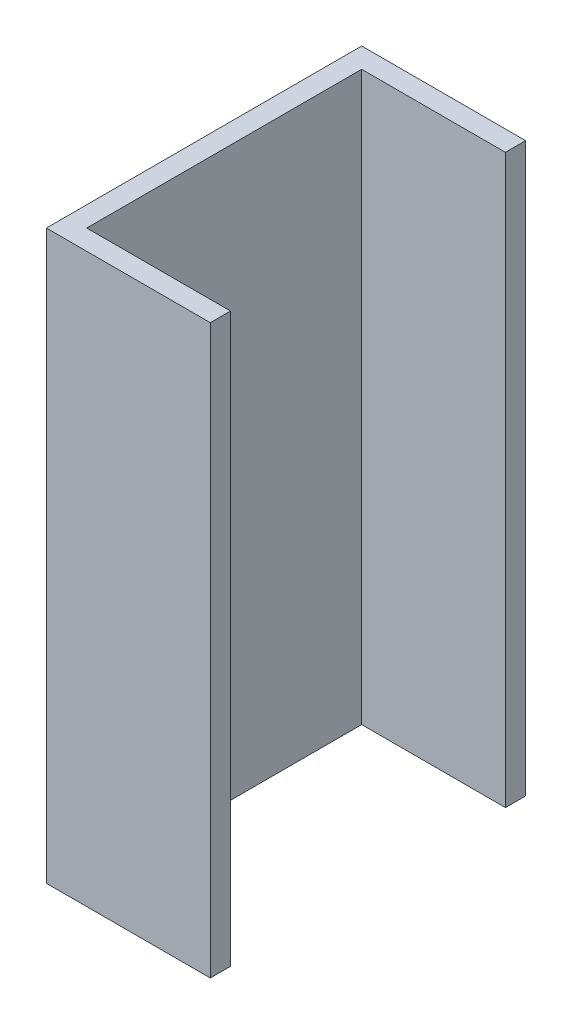
ISO-10303-21;
HEADER;
FILE_DESCRIPTION(('STEP AP214'),'2;1');
FILE_NAME('part.step','',(''),(''),'','','');
FILE_SCHEMA(('AUTOMOTIVE_DESIGN { 1 0 10303 214 1 1 1 1 }'));
ENDSEC;
DATA;
#1=APPLICATION_CONTEXT('core data for automotive mechanical design processes');
#2=APPLICATION_PROTOCOL_DEFINITION('international standard','automotive_design',2000,#1);
#3=PRODUCT_CONTEXT('',#1,'mechanical');
#4=PRODUCT('Part','Part','',(#3));
#5=PRODUCT_RELATED_PRODUCT_CATEGORY('part','',(#4));
#6=PRODUCT_DEFINITION_FORMATION('','',#4);
#7=PRODUCT_DEFINITION_CONTEXT('part definition',#1,'design');
#8=PRODUCT_DEFINITION('design','',#6,#7);
#9=PRODUCT_DEFINITION_SHAPE('','',#8);
#10=(LENGTH_UNIT() NAMED_UNIT(*) SI_UNIT(.MILLI.,.METRE.));
#11=(NAMED_UNIT(*) PLANE_ANGLE_UNIT() SI_UNIT($,.RADIAN.));
#12=(NAMED_UNIT(*) SI_UNIT($,.STERADIAN.) SOLID_ANGLE_UNIT());
#13=UNCERTAINTY_MEASURE_WITH_UNIT(LENGTH_MEASURE(1.E-05),#10,'distance_accuracy_value','');
#14=(GEOMETRIC_REPRESENTATION_CONTEXT(3) GLOBAL_UNCERTAINTY_ASSIGNED_CONTEXT((#13)) GLOBAL_UNIT_ASSIGNED_CONTEXT((#10,
#11,#12)) REPRESENTATION_CONTEXT('',''));
#15=CARTESIAN_POINT('',(0.,0.,0.));
#16=DIRECTION('',(0.,0.,1.));
#17=DIRECTION('',(1.,0.,0.));
#18=AXIS2_PLACEMENT_3D('',#15,#16,#17);
#19=CARTESIAN_POINT('',(65.,112.5,-62.5));
#20=DIRECTION('',(-1.,0.,0.));
#21=DIRECTION('',(0.,0.,1.));
#22=AXIS2_PLACEMENT_3D('',#19,#20,#21);
#23=PLANE('',#22);
#24=DIRECTION('',(0.,0.,-1.));
#25=VECTOR('',#24,1.);
#26=CARTESIAN_POINT('',(65.,-112.5,-62.5));
#27=LINE('',#26,#25);
#28=CARTESIAN_POINT('',(65.,-112.5,-54.5));
#29=VERTEX_POINT('',#28);
#30=CARTESIAN_POINT('',(65.,-112.5,-62.5));
#31=VERTEX_POINT('',#30);
#32=EDGE_CURVE('E133',#29,#31,#27,.T.);
#33=ORIENTED_EDGE('',*,*,#32,.T.);
#34=DIRECTION('',(0.,-1.,0.));
#35=VECTOR('',#34,1.);
#36=CARTESIAN_POINT('',(65.,112.5,-62.5));
#37=LINE('',#36,#35);
#38=CARTESIAN_POINT('',(65.,112.5,-62.5));
#39=VERTEX_POINT('',#38);
#40=EDGE_CURVE('E11',#39,#31,#37,.T.);
#41=ORIENTED_EDGE('',*,*,#40,.F.);
#42=DIRECTION('',(0.,0.,-1.));
#43=VECTOR('',#42,1.);
#44=CARTESIAN_POINT('',(65.,112.5,-62.5));
#45=LINE('',#44,#43);
#46=CARTESIAN_POINT('',(65.,112.5,-54.5));
#47=VERTEX_POINT('',#46);
#48=EDGE_CURVE('E147',#47,#39,#45,.T.);
#49=ORIENTED_EDGE('',*,*,#48,.F.);
#50=DIRECTION('',(0.,-1.,0.));
#51=VECTOR('',#50,1.);
#52=CARTESIAN_POINT('',(65.,112.5,-54.5));
#53=LINE('',#52,#51);
#54=EDGE_CURVE('E129',#47,#29,#53,.T.);
#55=ORIENTED_EDGE('',*,*,#54,.T.);
#56=EDGE_LOOP('',(#33,#41,#49,#55));
#57=FACE_BOUND('',#56,.T.);
#58=ADVANCED_FACE('F37',(#57),#23,.F.);
#59=CARTESIAN_POINT('',(0.,112.5,-62.5));
#60=DIRECTION('',(0.,0.,1.));
#61=DIRECTION('',(1.,0.,0.));
#62=AXIS2_PLACEMENT_3D('',#59,#60,#61);
#63=PLANE('',#62);
#64=DIRECTION('',(-1.,0.,0.));
#65=VECTOR('',#64,1.);
#66=CARTESIAN_POINT('',(0.,-112.5,-62.5));
#67=LINE('',#66,#65);
#68=CARTESIAN_POINT('',(0.,-112.5,-62.5));
#69=VERTEX_POINT('',#68);
#70=EDGE_CURVE('E136',#31,#69,#67,.T.);
#71=ORIENTED_EDGE('',*,*,#70,.T.);
#72=DIRECTION('',(0.,-1.,0.));
#73=VECTOR('',#72,1.);
#74=CARTESIAN_POINT('',(0.,112.5,-62.5));
#75=LINE('',#74,#73);
#76=CARTESIAN_POINT('',(0.,112.5,-62.5));
#77=VERTEX_POINT('',#76);
#78=EDGE_CURVE('E45',#77,#69,#75,.T.);
#79=ORIENTED_EDGE('',*,*,#78,.F.);
#80=DIRECTION('',(-1.,0.,0.));
#81=VECTOR('',#80,1.);
#82=CARTESIAN_POINT('',(0.,112.5,-62.5));
#83=LINE('',#82,#81);
#84=EDGE_CURVE('E96',#39,#77,#83,.T.);
#85=ORIENTED_EDGE('',*,*,#84,.F.);
#86=ORIENTED_EDGE('',*,*,#40,.T.);
#87=EDGE_LOOP('',(#71,#79,#85,#86));
#88=FACE_BOUND('',#87,.T.);
#89=ADVANCED_FACE('F182',(#88),#63,.F.);
#90=CARTESIAN_POINT('',(0.,112.5,62.5));
#91=DIRECTION('',(1.,0.,0.));
#92=DIRECTION('',(0.,0.,-1.));
#93=AXIS2_PLACEMENT_3D('',#90,#91,#92);
#94=PLANE('',#93);
#95=DIRECTION('',(0.,0.,1.));
#96=VECTOR('',#95,1.);
#97=CARTESIAN_POINT('',(0.,-112.5,62.5));
#98=LINE('',#97,#96);
#99=CARTESIAN_POINT('',(0.,-112.5,62.5));
#100=VERTEX_POINT('',#99);
#101=EDGE_CURVE('E138',#69,#100,#98,.T.);
#102=ORIENTED_EDGE('',*,*,#101,.T.);
#103=DIRECTION('',(0.,-1.,0.));
#104=VECTOR('',#103,1.);
#105=CARTESIAN_POINT('',(0.,112.5,62.5));
#106=LINE('',#105,#104);
#107=CARTESIAN_POINT('',(0.,112.5,62.5));
#108=VERTEX_POINT('',#107);
#109=EDGE_CURVE('E154',#108,#100,#106,.T.);
#110=ORIENTED_EDGE('',*,*,#109,.F.);
#111=DIRECTION('',(0.,0.,1.));
#112=VECTOR('',#111,1.);
#113=CARTESIAN_POINT('',(0.,112.5,62.5));
#114=LINE('',#113,#112);
#115=EDGE_CURVE('E162',#77,#108,#114,.T.);
#116=ORIENTED_EDGE('',*,*,#115,.F.);
#117=ORIENTED_EDGE('',*,*,#78,.T.);
#118=EDGE_LOOP('',(#102,#110,#116,#117));
#119=FACE_BOUND('',#118,.T.);
#120=ADVANCED_FACE('F160',(#119),#94,.F.);
#121=CARTESIAN_POINT('',(0.,112.5,62.5));
#122=DIRECTION('',(0.,0.,-1.));
#123=DIRECTION('',(-1.,0.,0.));
#124=AXIS2_PLACEMENT_3D('',#121,#122,#123);
#125=PLANE('',#124);
#126=DIRECTION('',(1.,0.,0.));
#127=VECTOR('',#126,1.);
#128=CARTESIAN_POINT('',(0.,-112.5,62.5));
#129=LINE('',#128,#127);
#130=CARTESIAN_POINT('',(65.,-112.5,62.5));
#131=VERTEX_POINT('',#130);
#132=EDGE_CURVE('E140',#100,#131,#129,.T.);
#133=ORIENTED_EDGE('',*,*,#132,.T.);
#134=DIRECTION('',(0.,-1.,0.));
#135=VECTOR('',#134,1.);
#136=CARTESIAN_POINT('',(65.,112.5,62.5));
#137=LINE('',#136,#135);
#138=CARTESIAN_POINT('',(65.,112.5,62.5));
#139=VERTEX_POINT('',#138);
#140=EDGE_CURVE('E151',#139,#131,#137,.T.);
#141=ORIENTED_EDGE('',*,*,#140,.F.);
#142=DIRECTION('',(1.,0.,0.));
#143=VECTOR('',#142,1.);
#144=CARTESIAN_POINT('',(0.,112.5,62.5));
#145=LINE('',#144,#143);
#146=EDGE_CURVE('E174',#108,#139,#145,.T.);
#147=ORIENTED_EDGE('',*,*,#146,.F.);
#148=ORIENTED_EDGE('',*,*,#109,.T.);
#149=EDGE_LOOP('',(#133,#141,#147,#148));
#150=FACE_BOUND('',#149,.T.);
#151=ADVANCED_FACE('F170',(#150),#125,.F.);
#152=CARTESIAN_POINT('',(65.,112.5,62.5));
#153=DIRECTION('',(-1.,0.,0.));
#154=DIRECTION('',(0.,0.,1.));
#155=AXIS2_PLACEMENT_3D('',#152,#153,#154);
#156=PLANE('',#155);
#157=DIRECTION('',(0.,0.,-1.));
#158=VECTOR('',#157,1.);
#159=CARTESIAN_POINT('',(65.,-112.5,62.5));
#160=LINE('',#159,#158);
#161=CARTESIAN_POINT('',(65.,-112.5,54.5));
#162=VERTEX_POINT('',#161);
#163=EDGE_CURVE('E142',#131,#162,#160,.T.);
#164=ORIENTED_EDGE('',*,*,#163,.T.);
#165=DIRECTION('',(0.,-1.,0.));
#166=VECTOR('',#165,1.);
#167=CARTESIAN_POINT('',(65.,112.5,54.5));
#168=LINE('',#167,#166);
#169=CARTESIAN_POINT('',(65.,112.5,54.5));
#170=VERTEX_POINT('',#169);
#171=EDGE_CURVE('E124',#170,#162,#168,.T.);
#172=ORIENTED_EDGE('',*,*,#171,.F.);
#173=DIRECTION('',(0.,0.,-1.));
#174=VECTOR('',#173,1.);
#175=CARTESIAN_POINT('',(65.,112.5,62.5));
#176=LINE('',#175,#174);
#177=EDGE_CURVE('E115',#139,#170,#176,.T.);
#178=ORIENTED_EDGE('',*,*,#177,.F.);
#179=ORIENTED_EDGE('',*,*,#140,.T.);
#180=EDGE_LOOP('',(#164,#172,#178,#179));
#181=FACE_BOUND('',#180,.T.);
#182=ADVANCED_FACE('F173',(#181),#156,.F.);
#183=CARTESIAN_POINT('',(65.,112.5,54.5));
#184=DIRECTION('',(0.,0.,1.));
#185=DIRECTION('',(1.,0.,0.));
#186=AXIS2_PLACEMENT_3D('',#183,#184,#185);
#187=PLANE('',#186);
#188=DIRECTION('',(-1.,0.,0.));
#189=VECTOR('',#188,1.);
#190=CARTESIAN_POINT('',(65.,-112.5,54.5));
#191=LINE('',#190,#189);
#192=CARTESIAN_POINT('',(8.00000000000001,-112.5,54.5));
#193=VERTEX_POINT('',#192);
#194=EDGE_CURVE('E123',#162,#193,#191,.T.);
#195=ORIENTED_EDGE('',*,*,#194,.T.);
#196=DIRECTION('',(0.,-1.,0.));
#197=VECTOR('',#196,1.);
#198=CARTESIAN_POINT('',(8.00000000000001,112.5,54.5));
#199=LINE('',#198,#197);
#200=CARTESIAN_POINT('',(8.00000000000001,112.5,54.5));
#201=VERTEX_POINT('',#200);
#202=EDGE_CURVE('E120',#201,#193,#199,.T.);
#203=ORIENTED_EDGE('',*,*,#202,.F.);
#204=DIRECTION('',(-1.,0.,0.));
#205=VECTOR('',#204,1.);
#206=CARTESIAN_POINT('',(65.,112.5,54.5));
#207=LINE('',#206,#205);
#208=EDGE_CURVE('E109',#170,#201,#207,.T.);
#209=ORIENTED_EDGE('',*,*,#208,.F.);
#210=ORIENTED_EDGE('',*,*,#171,.T.);
#211=EDGE_LOOP('',(#195,#203,#209,#210));
#212=FACE_BOUND('',#211,.T.);
#213=ADVANCED_FACE('F121',(#212),#187,.F.);
#214=CARTESIAN_POINT('',(8.00000000000001,112.5,-54.5));
#215=DIRECTION('',(-1.,0.,0.));
#216=DIRECTION('',(0.,0.,1.));
#217=AXIS2_PLACEMENT_3D('',#214,#215,#216);
#218=PLANE('',#217);
#219=DIRECTION('',(0.,0.,-1.));
#220=VECTOR('',#219,1.);
#221=CARTESIAN_POINT('',(8.00000000000001,-112.5,-54.5));
#222=LINE('',#221,#220);
#223=CARTESIAN_POINT('',(8.00000000000001,-112.5,-54.5));
#224=VERTEX_POINT('',#223);
#225=EDGE_CURVE('E82',#193,#224,#222,.T.);
#226=ORIENTED_EDGE('',*,*,#225,.T.);
#227=DIRECTION('',(0.,-1.,0.));
#228=VECTOR('',#227,1.);
#229=CARTESIAN_POINT('',(8.00000000000001,112.5,-54.5));
#230=LINE('',#229,#228);
#231=CARTESIAN_POINT('',(8.00000000000001,112.5,-54.5));
#232=VERTEX_POINT('',#231);
#233=EDGE_CURVE('E125',#232,#224,#230,.T.);
#234=ORIENTED_EDGE('',*,*,#233,.F.);
#235=DIRECTION('',(0.,0.,-1.));
#236=VECTOR('',#235,1.);
#237=CARTESIAN_POINT('',(8.00000000000001,112.5,-54.5));
#238=LINE('',#237,#236);
#239=EDGE_CURVE('E113',#201,#232,#238,.T.);
#240=ORIENTED_EDGE('',*,*,#239,.F.);
#241=ORIENTED_EDGE('',*,*,#202,.T.);
#242=EDGE_LOOP('',(#226,#234,#240,#241));
#243=FACE_BOUND('',#242,.T.);
#244=ADVANCED_FACE('F127',(#243),#218,.F.);
#245=CARTESIAN_POINT('',(65.,112.5,-54.5));
#246=DIRECTION('',(0.,0.,-1.));
#247=DIRECTION('',(-1.,0.,0.));
#248=AXIS2_PLACEMENT_3D('',#245,#246,#247);
#249=PLANE('',#248);
#250=DIRECTION('',(1.,0.,0.));
#251=VECTOR('',#250,1.);
#252=CARTESIAN_POINT('',(65.,-112.5,-54.5));
#253=LINE('',#252,#251);
#254=EDGE_CURVE('E88',#224,#29,#253,.T.);
#255=ORIENTED_EDGE('',*,*,#254,.T.);
#256=ORIENTED_EDGE('',*,*,#54,.F.);
#257=DIRECTION('',(1.,0.,0.));
#258=VECTOR('',#257,1.);
#259=CARTESIAN_POINT('',(65.,112.5,-54.5));
#260=LINE('',#259,#258);
#261=EDGE_CURVE('E53',#232,#47,#260,.T.);
#262=ORIENTED_EDGE('',*,*,#261,.F.);
#263=ORIENTED_EDGE('',*,*,#233,.T.);
#264=EDGE_LOOP('',(#255,#256,#262,#263));
#265=FACE_BOUND('',#264,.T.);
#266=ADVANCED_FACE('F198',(#265),#249,.F.);
#267=CARTESIAN_POINT('',(0.,112.5,0.));
#268=DIRECTION('',(0.,-1.,0.));
#269=DIRECTION('',(0.,0.,-1.));
#270=AXIS2_PLACEMENT_3D('',#267,#268,#269);
#271=PLANE('',#270);
#272=ORIENTED_EDGE('',*,*,#48,.T.);
#273=ORIENTED_EDGE('',*,*,#84,.T.);
#274=ORIENTED_EDGE('',*,*,#115,.T.);
#275=ORIENTED_EDGE('',*,*,#146,.T.);
#276=ORIENTED_EDGE('',*,*,#177,.T.);
#277=ORIENTED_EDGE('',*,*,#208,.T.);
#278=ORIENTED_EDGE('',*,*,#239,.T.);
#279=ORIENTED_EDGE('',*,*,#261,.T.);
#280=EDGE_LOOP('',(#272,#273,#274,#275,#276,#277,#278,#279));
#281=FACE_BOUND('',#280,.T.);
#282=ADVANCED_FACE('F111',(#281),#271,.F.);
#283=CARTESIAN_POINT('',(0.,-112.5,0.));
#284=DIRECTION('',(0.,-1.,0.));
#285=DIRECTION('',(0.,0.,-1.));
#286=AXIS2_PLACEMENT_3D('',#283,#284,#285);
#287=PLANE('',#286);
#288=ORIENTED_EDGE('',*,*,#32,.F.);
#289=ORIENTED_EDGE('',*,*,#254,.F.);
#290=ORIENTED_EDGE('',*,*,#225,.F.);
#291=ORIENTED_EDGE('',*,*,#194,.F.);
#292=ORIENTED_EDGE('',*,*,#163,.F.);
#293=ORIENTED_EDGE('',*,*,#132,.F.);
#294=ORIENTED_EDGE('',*,*,#101,.F.);
#295=ORIENTED_EDGE('',*,*,#70,.F.);
#296=EDGE_LOOP('',(#288,#289,#290,#291,#292,#293,#294,#295));
#297=FACE_BOUND('',#296,.T.);
#298=ADVANCED_FACE('F166',(#297),#287,.T.);
#299=CLOSED_SHELL('',(#58,#89,#120,#151,#182,#213,#244,#266,#282,#298));
#300=MANIFOLD_SOLID_BREP('B2',#299);
#301=ADVANCED_BREP_SHAPE_REPRESENTATION('',(#18,#300),#14);
#302=SHAPE_DEFINITION_REPRESENTATION(#9,#301);
ENDSEC;
END-ISO-10303-21;
